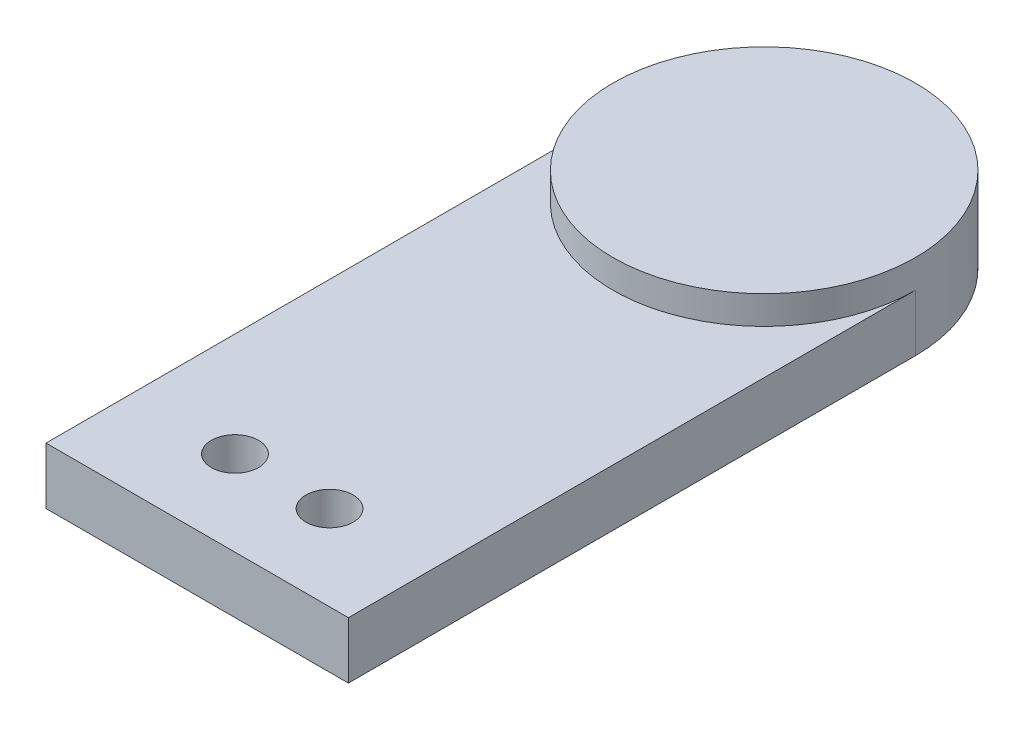
ISO-10303-21;
HEADER;
FILE_DESCRIPTION(('STEP AP214'),'2;1');
FILE_NAME('part.step','',(''),(''),'','','');
FILE_SCHEMA(('AUTOMOTIVE_DESIGN { 1 0 10303 214 1 1 1 1 }'));
ENDSEC;
DATA;
#1=APPLICATION_CONTEXT('core data for automotive mechanical design processes');
#2=APPLICATION_PROTOCOL_DEFINITION('international standard','automotive_design',2000,#1);
#3=PRODUCT_CONTEXT('',#1,'mechanical');
#4=PRODUCT('Part','Part','',(#3));
#5=PRODUCT_RELATED_PRODUCT_CATEGORY('part','',(#4));
#6=PRODUCT_DEFINITION_FORMATION('','',#4);
#7=PRODUCT_DEFINITION_CONTEXT('part definition',#1,'design');
#8=PRODUCT_DEFINITION('design','',#6,#7);
#9=PRODUCT_DEFINITION_SHAPE('','',#8);
#10=(LENGTH_UNIT() NAMED_UNIT(*) SI_UNIT(.MILLI.,.METRE.));
#11=(NAMED_UNIT(*) PLANE_ANGLE_UNIT() SI_UNIT($,.RADIAN.));
#12=(NAMED_UNIT(*) SI_UNIT($,.STERADIAN.) SOLID_ANGLE_UNIT());
#13=UNCERTAINTY_MEASURE_WITH_UNIT(LENGTH_MEASURE(1.E-05),#10,'distance_accuracy_value','');
#14=(GEOMETRIC_REPRESENTATION_CONTEXT(3) GLOBAL_UNCERTAINTY_ASSIGNED_CONTEXT((#13)) GLOBAL_UNIT_ASSIGNED_CONTEXT((#10,
#11,#12)) REPRESENTATION_CONTEXT('',''));
#15=CARTESIAN_POINT('',(0.,0.,0.));
#16=DIRECTION('',(0.,0.,1.));
#17=DIRECTION('',(1.,0.,0.));
#18=AXIS2_PLACEMENT_3D('',#15,#16,#17);
#19=CARTESIAN_POINT('',(0.,3.,0.));
#20=DIRECTION('',(0.,-1.,0.));
#21=DIRECTION('',(0.,0.,-1.));
#22=AXIS2_PLACEMENT_3D('',#19,#20,#21);
#23=CYLINDRICAL_SURFACE('',#22,8.);
#24=CARTESIAN_POINT('',(0.,3.,0.));
#25=DIRECTION('',(0.,1.,0.));
#26=DIRECTION('',(0.,0.,1.));
#27=AXIS2_PLACEMENT_3D('',#24,#25,#26);
#28=CIRCLE('',#27,8.);
#29=CARTESIAN_POINT('',(0.,3.,8.));
#30=VERTEX_POINT('',#29);
#31=EDGE_CURVE('E45',#30,#30,#28,.T.);
#32=ORIENTED_EDGE('',*,*,#31,.F.);
#33=EDGE_LOOP('',(#32));
#34=FACE_BOUND('',#33,.T.);
#35=DIRECTION('',(0.,-1.,0.));
#36=VECTOR('',#35,1.);
#37=CARTESIAN_POINT('',(-8.,1.5,0.));
#38=LINE('',#37,#36);
#39=CARTESIAN_POINT('',(-8.,1.5,0.));
#40=VERTEX_POINT('',#39);
#41=CARTESIAN_POINT('',(-8.,-1.5,0.));
#42=VERTEX_POINT('',#41);
#43=EDGE_CURVE('E55',#40,#42,#38,.T.);
#44=ORIENTED_EDGE('',*,*,#43,.F.);
#45=CARTESIAN_POINT('',(0.,1.5,0.));
#46=DIRECTION('',(0.,1.,0.));
#47=DIRECTION('',(0.,0.,1.));
#48=AXIS2_PLACEMENT_3D('',#45,#46,#47);
#49=CIRCLE('',#48,8.);
#50=CARTESIAN_POINT('',(8.,1.5,0.));
#51=VERTEX_POINT('',#50);
#52=EDGE_CURVE('E11',#40,#51,#49,.T.);
#53=ORIENTED_EDGE('',*,*,#52,.T.);
#54=DIRECTION('',(0.,-1.,0.));
#55=VECTOR('',#54,1.);
#56=CARTESIAN_POINT('',(8.,1.5,0.));
#57=LINE('',#56,#55);
#58=CARTESIAN_POINT('',(8.,-1.5,0.));
#59=VERTEX_POINT('',#58);
#60=EDGE_CURVE('E99',#51,#59,#57,.T.);
#61=ORIENTED_EDGE('',*,*,#60,.T.);
#62=CARTESIAN_POINT('',(0.,-1.5,0.));
#63=DIRECTION('',(0.,1.,0.));
#64=DIRECTION('',(0.,0.,1.));
#65=AXIS2_PLACEMENT_3D('',#62,#63,#64);
#66=CIRCLE('',#65,8.);
#67=EDGE_CURVE('E96',#59,#42,#66,.T.);
#68=ORIENTED_EDGE('',*,*,#67,.T.);
#69=EDGE_LOOP('',(#44,#53,#61,#68));
#70=FACE_BOUND('',#69,.T.);
#71=ADVANCED_FACE('F37',(#34,#70),#23,.T.);
#72=CARTESIAN_POINT('',(0.,3.,0.));
#73=DIRECTION('',(0.,1.,0.));
#74=DIRECTION('',(0.,0.,1.));
#75=AXIS2_PLACEMENT_3D('',#72,#73,#74);
#76=PLANE('',#75);
#77=ORIENTED_EDGE('',*,*,#31,.T.);
#78=EDGE_LOOP('',(#77));
#79=FACE_BOUND('',#78,.T.);
#80=ADVANCED_FACE('F106',(#79),#76,.T.);
#81=CARTESIAN_POINT('',(0.,-1.5,0.));
#82=DIRECTION('',(0.,1.,0.));
#83=DIRECTION('',(0.,0.,1.));
#84=AXIS2_PLACEMENT_3D('',#81,#82,#83);
#85=PLANE('',#84);
#86=CARTESIAN_POINT('',(0.,-1.5,0.));
#87=DIRECTION('',(0.,1.,0.));
#88=DIRECTION('',(0.,0.,1.));
#89=AXIS2_PLACEMENT_3D('',#86,#87,#88);
#90=CIRCLE('',#89,3.3);
#91=CARTESIAN_POINT('',(0.,-1.5,3.3));
#92=VERTEX_POINT('',#91);
#93=EDGE_CURVE('E40',#92,#92,#90,.T.);
#94=ORIENTED_EDGE('',*,*,#93,.T.);
#95=EDGE_LOOP('',(#94));
#96=FACE_BOUND('',#95,.T.);
#97=CARTESIAN_POINT('',(-2.50307341777023,-1.5,25.5));
#98=DIRECTION('',(0.,-1.,0.));
#99=DIRECTION('',(0.,0.,-1.));
#100=AXIS2_PLACEMENT_3D('',#97,#98,#99);
#101=CIRCLE('',#100,1.25);
#102=CARTESIAN_POINT('',(-2.50307341777023,-1.5,24.25));
#103=VERTEX_POINT('',#102);
#104=EDGE_CURVE('E159',#103,#103,#101,.T.);
#105=ORIENTED_EDGE('',*,*,#104,.F.);
#106=EDGE_LOOP('',(#105));
#107=FACE_BOUND('',#106,.T.);
#108=CARTESIAN_POINT('',(2.50307341777,-1.5,25.5));
#109=DIRECTION('',(0.,-1.,0.));
#110=DIRECTION('',(0.,0.,-1.));
#111=AXIS2_PLACEMENT_3D('',#108,#109,#110);
#112=CIRCLE('',#111,1.25);
#113=CARTESIAN_POINT('',(2.50307341777,-1.5,24.25));
#114=VERTEX_POINT('',#113);
#115=EDGE_CURVE('E145',#114,#114,#112,.T.);
#116=ORIENTED_EDGE('',*,*,#115,.F.);
#117=EDGE_LOOP('',(#116));
#118=FACE_BOUND('',#117,.T.);
#119=ORIENTED_EDGE('',*,*,#67,.F.);
#120=DIRECTION('',(0.,0.,-1.));
#121=VECTOR('',#120,1.);
#122=CARTESIAN_POINT('',(8.,-1.5,0.));
#123=LINE('',#122,#121);
#124=CARTESIAN_POINT('',(8.,-1.5,30.));
#125=VERTEX_POINT('',#124);
#126=EDGE_CURVE('E91',#125,#59,#123,.T.);
#127=ORIENTED_EDGE('',*,*,#126,.F.);
#128=DIRECTION('',(1.,0.,0.));
#129=VECTOR('',#128,1.);
#130=CARTESIAN_POINT('',(-8.,-1.5,30.));
#131=LINE('',#130,#129);
#132=CARTESIAN_POINT('',(-8.,-1.5,30.));
#133=VERTEX_POINT('',#132);
#134=EDGE_CURVE('E158',#133,#125,#131,.T.);
#135=ORIENTED_EDGE('',*,*,#134,.F.);
#136=DIRECTION('',(0.,0.,1.));
#137=VECTOR('',#136,1.);
#138=CARTESIAN_POINT('',(-8.,-1.5,0.));
#139=LINE('',#138,#137);
#140=EDGE_CURVE('E95',#42,#133,#139,.T.);
#141=ORIENTED_EDGE('',*,*,#140,.F.);
#142=EDGE_LOOP('',(#119,#127,#135,#141));
#143=FACE_BOUND('',#142,.T.);
#144=ADVANCED_FACE('F112',(#96,#107,#118,#143),#85,.F.);
#145=CARTESIAN_POINT('',(-8.,1.5,0.));
#146=DIRECTION('',(1.,0.,0.));
#147=DIRECTION('',(0.,0.,-1.));
#148=AXIS2_PLACEMENT_3D('',#145,#146,#147);
#149=PLANE('',#148);
#150=ORIENTED_EDGE('',*,*,#140,.T.);
#151=DIRECTION('',(0.,-1.,0.));
#152=VECTOR('',#151,1.);
#153=CARTESIAN_POINT('',(-8.,1.5,30.));
#154=LINE('',#153,#152);
#155=CARTESIAN_POINT('',(-8.,1.5,30.));
#156=VERTEX_POINT('',#155);
#157=EDGE_CURVE('E79',#156,#133,#154,.T.);
#158=ORIENTED_EDGE('',*,*,#157,.F.);
#159=DIRECTION('',(0.,0.,1.));
#160=VECTOR('',#159,1.);
#161=CARTESIAN_POINT('',(-8.,1.5,0.));
#162=LINE('',#161,#160);
#163=EDGE_CURVE('E86',#40,#156,#162,.T.);
#164=ORIENTED_EDGE('',*,*,#163,.F.);
#165=ORIENTED_EDGE('',*,*,#43,.T.);
#166=EDGE_LOOP('',(#150,#158,#164,#165));
#167=FACE_BOUND('',#166,.T.);
#168=ADVANCED_FACE('F93',(#167),#149,.F.);
#169=CARTESIAN_POINT('',(-8.,1.5,30.));
#170=DIRECTION('',(0.,0.,-1.));
#171=DIRECTION('',(-1.,0.,0.));
#172=AXIS2_PLACEMENT_3D('',#169,#170,#171);
#173=PLANE('',#172);
#174=ORIENTED_EDGE('',*,*,#134,.T.);
#175=DIRECTION('',(0.,-1.,0.));
#176=VECTOR('',#175,1.);
#177=CARTESIAN_POINT('',(8.,1.5,30.));
#178=LINE('',#177,#176);
#179=CARTESIAN_POINT('',(8.,1.5,30.));
#180=VERTEX_POINT('',#179);
#181=EDGE_CURVE('E82',#180,#125,#178,.T.);
#182=ORIENTED_EDGE('',*,*,#181,.F.);
#183=DIRECTION('',(1.,0.,0.));
#184=VECTOR('',#183,1.);
#185=CARTESIAN_POINT('',(-8.,1.5,30.));
#186=LINE('',#185,#184);
#187=EDGE_CURVE('E75',#156,#180,#186,.T.);
#188=ORIENTED_EDGE('',*,*,#187,.F.);
#189=ORIENTED_EDGE('',*,*,#157,.T.);
#190=EDGE_LOOP('',(#174,#182,#188,#189));
#191=FACE_BOUND('',#190,.T.);
#192=ADVANCED_FACE('F77',(#191),#173,.F.);
#193=CARTESIAN_POINT('',(8.,1.5,0.));
#194=DIRECTION('',(-1.,0.,0.));
#195=DIRECTION('',(0.,0.,1.));
#196=AXIS2_PLACEMENT_3D('',#193,#194,#195);
#197=PLANE('',#196);
#198=ORIENTED_EDGE('',*,*,#126,.T.);
#199=ORIENTED_EDGE('',*,*,#60,.F.);
#200=DIRECTION('',(0.,0.,-1.));
#201=VECTOR('',#200,1.);
#202=CARTESIAN_POINT('',(8.,1.5,0.));
#203=LINE('',#202,#201);
#204=EDGE_CURVE('E85',#180,#51,#203,.T.);
#205=ORIENTED_EDGE('',*,*,#204,.F.);
#206=ORIENTED_EDGE('',*,*,#181,.T.);
#207=EDGE_LOOP('',(#198,#199,#205,#206));
#208=FACE_BOUND('',#207,.T.);
#209=ADVANCED_FACE('F123',(#208),#197,.F.);
#210=CARTESIAN_POINT('',(0.,1.5,0.));
#211=DIRECTION('',(0.,1.,0.));
#212=DIRECTION('',(0.,0.,1.));
#213=AXIS2_PLACEMENT_3D('',#210,#211,#212);
#214=PLANE('',#213);
#215=CARTESIAN_POINT('',(-2.50307341777023,1.5,25.5));
#216=DIRECTION('',(0.,1.,0.));
#217=DIRECTION('',(0.,0.,1.));
#218=AXIS2_PLACEMENT_3D('',#215,#216,#217);
#219=CIRCLE('',#218,1.25);
#220=CARTESIAN_POINT('',(-2.50307341777023,1.5,26.75));
#221=VERTEX_POINT('',#220);
#222=EDGE_CURVE('E152',#221,#221,#219,.F.);
#223=ORIENTED_EDGE('',*,*,#222,.T.);
#224=EDGE_LOOP('',(#223));
#225=FACE_BOUND('',#224,.T.);
#226=CARTESIAN_POINT('',(2.50307341777,1.5,25.5));
#227=DIRECTION('',(0.,1.,0.));
#228=DIRECTION('',(0.,0.,1.));
#229=AXIS2_PLACEMENT_3D('',#226,#227,#228);
#230=CIRCLE('',#229,1.25);
#231=CARTESIAN_POINT('',(2.50307341777,1.5,26.75));
#232=VERTEX_POINT('',#231);
#233=EDGE_CURVE('E147',#232,#232,#230,.F.);
#234=ORIENTED_EDGE('',*,*,#233,.T.);
#235=EDGE_LOOP('',(#234));
#236=FACE_BOUND('',#235,.T.);
#237=ORIENTED_EDGE('',*,*,#52,.F.);
#238=ORIENTED_EDGE('',*,*,#163,.T.);
#239=ORIENTED_EDGE('',*,*,#187,.T.);
#240=ORIENTED_EDGE('',*,*,#204,.T.);
#241=EDGE_LOOP('',(#237,#238,#239,#240));
#242=FACE_BOUND('',#241,.T.);
#243=ADVANCED_FACE('F89',(#225,#236,#242),#214,.T.);
#244=CARTESIAN_POINT('',(2.50307341777,3.001,25.5));
#245=DIRECTION('',(0.,-1.,0.));
#246=DIRECTION('',(0.,0.,-1.));
#247=AXIS2_PLACEMENT_3D('',#244,#245,#246);
#248=CYLINDRICAL_SURFACE('',#247,1.25);
#249=ORIENTED_EDGE('',*,*,#233,.F.);
#250=EDGE_LOOP('',(#249));
#251=FACE_BOUND('',#250,.T.);
#252=ORIENTED_EDGE('',*,*,#115,.T.);
#253=EDGE_LOOP('',(#252));
#254=FACE_BOUND('',#253,.T.);
#255=ADVANCED_FACE('F129',(#251,#254),#248,.F.);
#256=CARTESIAN_POINT('',(-2.50307341777023,3.001,25.5));
#257=DIRECTION('',(0.,-1.,0.));
#258=DIRECTION('',(0.,0.,-1.));
#259=AXIS2_PLACEMENT_3D('',#256,#257,#258);
#260=CYLINDRICAL_SURFACE('',#259,1.25);
#261=ORIENTED_EDGE('',*,*,#222,.F.);
#262=EDGE_LOOP('',(#261));
#263=FACE_BOUND('',#262,.T.);
#264=ORIENTED_EDGE('',*,*,#104,.T.);
#265=EDGE_LOOP('',(#264));
#266=FACE_BOUND('',#265,.T.);
#267=ADVANCED_FACE('F133',(#263,#266),#260,.F.);
#268=CARTESIAN_POINT('',(0.,-1.5,0.));
#269=DIRECTION('',(1.,0.,0.));
#270=DIRECTION('',(0.,0.,-1.));
#271=AXIS2_PLACEMENT_3D('',#268,#269,#270);
#272=SPHERICAL_SURFACE('',#271,3.3);
#273=CARTESIAN_POINT('',(0.,-1.5,0.));
#274=DIRECTION('',(0.,1.,0.));
#275=DIRECTION('',(0.,0.,1.));
#276=AXIS2_PLACEMENT_3D('',#273,#274,#275);
#277=SPHERICAL_SURFACE('',#276,3.3);
#278=ORIENTED_EDGE('',*,*,#93,.F.);
#279=EDGE_LOOP('',(#278));
#280=FACE_BOUND('',#279,.T.);
#281=ADVANCED_FACE('F137',(#280),#277,.F.);
#282=CLOSED_SHELL('',(#71,#80,#144,#168,#192,#209,#243,#255,#267,#281));
#283=MANIFOLD_SOLID_BREP('B2',#282);
#284=ADVANCED_BREP_SHAPE_REPRESENTATION('',(#18,#283),#14);
#285=SHAPE_DEFINITION_REPRESENTATION(#9,#284);
ENDSEC;
END-ISO-10303-21;
